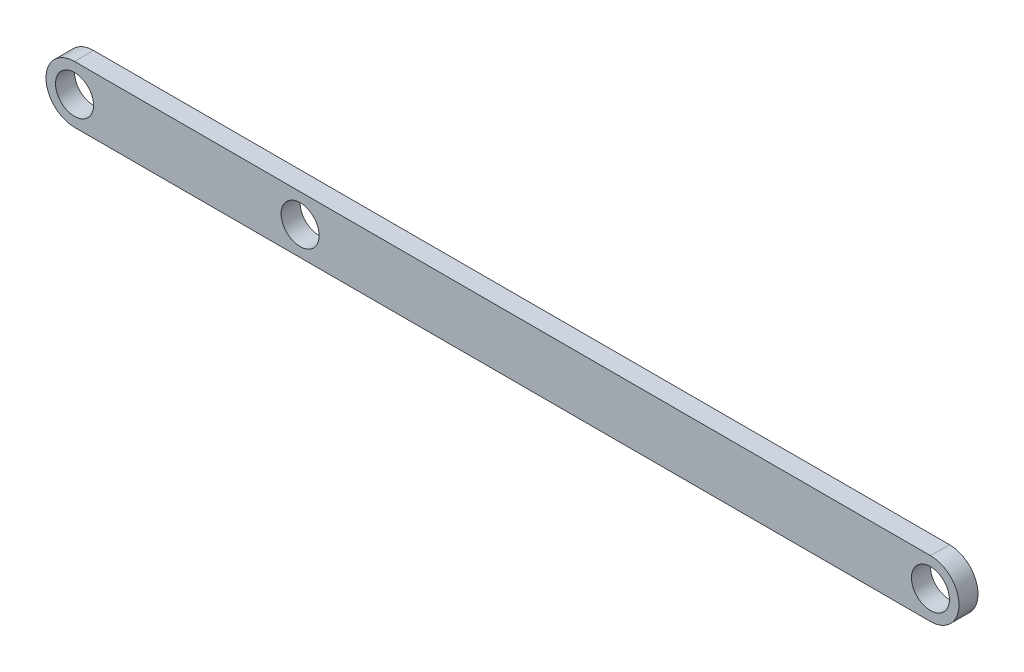
ISO-10303-21;
HEADER;
FILE_DESCRIPTION(('STEP AP214'),'2;1');
FILE_NAME('part.step','',(''),(''),'','','');
FILE_SCHEMA(('AUTOMOTIVE_DESIGN { 1 0 10303 214 1 1 1 1 }'));
ENDSEC;
DATA;
#1=APPLICATION_CONTEXT('core data for automotive mechanical design processes');
#2=APPLICATION_PROTOCOL_DEFINITION('international standard','automotive_design',2000,#1);
#3=PRODUCT_CONTEXT('',#1,'mechanical');
#4=PRODUCT('Part','Part','',(#3));
#5=PRODUCT_RELATED_PRODUCT_CATEGORY('part','',(#4));
#6=PRODUCT_DEFINITION_FORMATION('','',#4);
#7=PRODUCT_DEFINITION_CONTEXT('part definition',#1,'design');
#8=PRODUCT_DEFINITION('design','',#6,#7);
#9=PRODUCT_DEFINITION_SHAPE('','',#8);
#10=(LENGTH_UNIT() NAMED_UNIT(*) SI_UNIT(.MILLI.,.METRE.));
#11=(NAMED_UNIT(*) PLANE_ANGLE_UNIT() SI_UNIT($,.RADIAN.));
#12=(NAMED_UNIT(*) SI_UNIT($,.STERADIAN.) SOLID_ANGLE_UNIT());
#13=UNCERTAINTY_MEASURE_WITH_UNIT(LENGTH_MEASURE(1.E-05),#10,'distance_accuracy_value','');
#14=(GEOMETRIC_REPRESENTATION_CONTEXT(3) GLOBAL_UNCERTAINTY_ASSIGNED_CONTEXT((#13)) GLOBAL_UNIT_ASSIGNED_CONTEXT((#10,
#11,#12)) REPRESENTATION_CONTEXT('',''));
#15=CARTESIAN_POINT('',(0.,0.,0.));
#16=DIRECTION('',(0.,0.,1.));
#17=DIRECTION('',(1.,0.,0.));
#18=AXIS2_PLACEMENT_3D('',#15,#16,#17);
#19=CARTESIAN_POINT('',(0.,30.,10.));
#20=DIRECTION('',(0.,-1.,0.));
#21=DIRECTION('',(1.,0.,0.));
#22=AXIS2_PLACEMENT_3D('',#19,#20,#21);
#23=PLANE('',#22);
#24=DIRECTION('',(-1.,0.,0.));
#25=VECTOR('',#24,1.);
#26=CARTESIAN_POINT('',(0.,30.,0.));
#27=LINE('',#26,#25);
#28=CARTESIAN_POINT('',(0.,30.,0.));
#29=VERTEX_POINT('',#28);
#30=CARTESIAN_POINT('',(-450.,29.9999999999999,0.));
#31=VERTEX_POINT('',#30);
#32=EDGE_CURVE('E106',#29,#31,#27,.T.);
#33=ORIENTED_EDGE('',*,*,#32,.T.);
#34=DIRECTION('',(0.,0.,-1.));
#35=VECTOR('',#34,1.);
#36=CARTESIAN_POINT('',(-450.,29.9999999999999,10.));
#37=LINE('',#36,#35);
#38=CARTESIAN_POINT('',(-450.,29.9999999999999,10.));
#39=VERTEX_POINT('',#38);
#40=EDGE_CURVE('E11',#39,#31,#37,.T.);
#41=ORIENTED_EDGE('',*,*,#40,.F.);
#42=DIRECTION('',(-1.,0.,0.));
#43=VECTOR('',#42,1.);
#44=CARTESIAN_POINT('',(0.,30.,10.));
#45=LINE('',#44,#43);
#46=CARTESIAN_POINT('',(0.,30.,10.));
#47=VERTEX_POINT('',#46);
#48=EDGE_CURVE('E87',#47,#39,#45,.T.);
#49=ORIENTED_EDGE('',*,*,#48,.F.);
#50=DIRECTION('',(0.,0.,-1.));
#51=VECTOR('',#50,1.);
#52=CARTESIAN_POINT('',(0.,30.,10.));
#53=LINE('',#52,#51);
#54=EDGE_CURVE('E102',#47,#29,#53,.T.);
#55=ORIENTED_EDGE('',*,*,#54,.T.);
#56=EDGE_LOOP('',(#33,#41,#49,#55));
#57=FACE_BOUND('',#56,.T.);
#58=ADVANCED_FACE('F39',(#57),#23,.F.);
#59=CARTESIAN_POINT('',(-450.,14.9999999999999,10.));
#60=DIRECTION('',(0.,0.,-1.));
#61=DIRECTION('',(-1.,0.,0.));
#62=AXIS2_PLACEMENT_3D('',#59,#60,#61);
#63=CYLINDRICAL_SURFACE('',#62,15.);
#64=CARTESIAN_POINT('',(-450.,14.9999999999999,0.));
#65=DIRECTION('',(0.,0.,1.));
#66=DIRECTION('',(1.,0.,0.));
#67=AXIS2_PLACEMENT_3D('',#64,#65,#66);
#68=CIRCLE('',#67,15.);
#69=CARTESIAN_POINT('',(-450.,0.,0.));
#70=VERTEX_POINT('',#69);
#71=EDGE_CURVE('E93',#31,#70,#68,.T.);
#72=ORIENTED_EDGE('',*,*,#71,.T.);
#73=DIRECTION('',(0.,0.,-1.));
#74=VECTOR('',#73,1.);
#75=CARTESIAN_POINT('',(-450.,0.,10.));
#76=LINE('',#75,#74);
#77=CARTESIAN_POINT('',(-450.,0.,10.));
#78=VERTEX_POINT('',#77);
#79=EDGE_CURVE('E48',#78,#70,#76,.T.);
#80=ORIENTED_EDGE('',*,*,#79,.F.);
#81=CARTESIAN_POINT('',(-450.,14.9999999999999,10.));
#82=DIRECTION('',(0.,0.,1.));
#83=DIRECTION('',(1.,0.,0.));
#84=AXIS2_PLACEMENT_3D('',#81,#82,#83);
#85=CIRCLE('',#84,15.);
#86=EDGE_CURVE('E82',#39,#78,#85,.T.);
#87=ORIENTED_EDGE('',*,*,#86,.F.);
#88=ORIENTED_EDGE('',*,*,#40,.T.);
#89=EDGE_LOOP('',(#72,#80,#87,#88));
#90=FACE_BOUND('',#89,.T.);
#91=ADVANCED_FACE('F92',(#90),#63,.T.);
#92=CARTESIAN_POINT('',(0.,0.,10.));
#93=DIRECTION('',(0.,-1.,0.));
#94=DIRECTION('',(1.,0.,0.));
#95=AXIS2_PLACEMENT_3D('',#92,#93,#94);
#96=PLANE('',#95);
#97=DIRECTION('',(-1.,0.,0.));
#98=VECTOR('',#97,1.);
#99=CARTESIAN_POINT('',(0.,0.,0.));
#100=LINE('',#99,#98);
#101=CARTESIAN_POINT('',(0.,0.,0.));
#102=VERTEX_POINT('',#101);
#103=EDGE_CURVE('E113',#102,#70,#100,.T.);
#104=ORIENTED_EDGE('',*,*,#103,.F.);
#105=DIRECTION('',(0.,0.,-1.));
#106=VECTOR('',#105,1.);
#107=CARTESIAN_POINT('',(0.,0.,10.));
#108=LINE('',#107,#106);
#109=CARTESIAN_POINT('',(0.,0.,10.));
#110=VERTEX_POINT('',#109);
#111=EDGE_CURVE('E72',#110,#102,#108,.T.);
#112=ORIENTED_EDGE('',*,*,#111,.F.);
#113=DIRECTION('',(-1.,0.,0.));
#114=VECTOR('',#113,1.);
#115=CARTESIAN_POINT('',(0.,0.,10.));
#116=LINE('',#115,#114);
#117=EDGE_CURVE('E85',#110,#78,#116,.T.);
#118=ORIENTED_EDGE('',*,*,#117,.T.);
#119=ORIENTED_EDGE('',*,*,#79,.T.);
#120=EDGE_LOOP('',(#104,#112,#118,#119));
#121=FACE_BOUND('',#120,.T.);
#122=ADVANCED_FACE('F98',(#121),#96,.T.);
#123=CARTESIAN_POINT('',(0.,15.,10.));
#124=DIRECTION('',(0.,0.,-1.));
#125=DIRECTION('',(-1.,0.,0.));
#126=AXIS2_PLACEMENT_3D('',#123,#124,#125);
#127=CYLINDRICAL_SURFACE('',#126,15.);
#128=CARTESIAN_POINT('',(0.,15.,0.));
#129=DIRECTION('',(0.,0.,1.));
#130=DIRECTION('',(1.,0.,0.));
#131=AXIS2_PLACEMENT_3D('',#128,#129,#130);
#132=CIRCLE('',#131,15.);
#133=EDGE_CURVE('E75',#102,#29,#132,.T.);
#134=ORIENTED_EDGE('',*,*,#133,.T.);
#135=ORIENTED_EDGE('',*,*,#54,.F.);
#136=CARTESIAN_POINT('',(0.,15.,10.));
#137=DIRECTION('',(0.,0.,1.));
#138=DIRECTION('',(1.,0.,0.));
#139=AXIS2_PLACEMENT_3D('',#136,#137,#138);
#140=CIRCLE('',#139,15.);
#141=EDGE_CURVE('E56',#110,#47,#140,.T.);
#142=ORIENTED_EDGE('',*,*,#141,.F.);
#143=ORIENTED_EDGE('',*,*,#111,.T.);
#144=EDGE_LOOP('',(#134,#135,#142,#143));
#145=FACE_BOUND('',#144,.T.);
#146=ADVANCED_FACE('F136',(#145),#127,.T.);
#147=CARTESIAN_POINT('',(-450.,14.9999999999999,10.));
#148=DIRECTION('',(0.,0.,1.));
#149=DIRECTION('',(1.,0.,0.));
#150=AXIS2_PLACEMENT_3D('',#147,#148,#149);
#151=PLANE('',#150);
#152=CARTESIAN_POINT('',(-331.40838443026,14.9999999999999,10.));
#153=DIRECTION('',(0.,0.,1.));
#154=DIRECTION('',(1.,0.,0.));
#155=AXIS2_PLACEMENT_3D('',#152,#153,#154);
#156=CIRCLE('',#155,9.99999999999998);
#157=CARTESIAN_POINT('',(-321.40838443026,14.9999999999999,10.));
#158=VERTEX_POINT('',#157);
#159=EDGE_CURVE('E216',#158,#158,#156,.T.);
#160=ORIENTED_EDGE('',*,*,#159,.F.);
#161=EDGE_LOOP('',(#160));
#162=FACE_BOUND('',#161,.T.);
#163=CARTESIAN_POINT('',(0.,15.,10.));
#164=DIRECTION('',(0.,0.,-1.));
#165=DIRECTION('',(-1.,0.,0.));
#166=AXIS2_PLACEMENT_3D('',#163,#164,#165);
#167=CIRCLE('',#166,10.);
#168=CARTESIAN_POINT('',(-10.,15.,10.));
#169=VERTEX_POINT('',#168);
#170=EDGE_CURVE('E110',#169,#169,#167,.T.);
#171=ORIENTED_EDGE('',*,*,#170,.T.);
#172=EDGE_LOOP('',(#171));
#173=FACE_BOUND('',#172,.T.);
#174=CARTESIAN_POINT('',(-450.,14.9999999999999,10.));
#175=DIRECTION('',(0.,0.,-1.));
#176=DIRECTION('',(-1.,0.,0.));
#177=AXIS2_PLACEMENT_3D('',#174,#175,#176);
#178=CIRCLE('',#177,9.99999999999998);
#179=CARTESIAN_POINT('',(-460.,14.9999999999999,10.));
#180=VERTEX_POINT('',#179);
#181=EDGE_CURVE('E199',#180,#180,#178,.T.);
#182=ORIENTED_EDGE('',*,*,#181,.T.);
#183=EDGE_LOOP('',(#182));
#184=FACE_BOUND('',#183,.T.);
#185=ORIENTED_EDGE('',*,*,#48,.T.);
#186=ORIENTED_EDGE('',*,*,#86,.T.);
#187=ORIENTED_EDGE('',*,*,#117,.F.);
#188=ORIENTED_EDGE('',*,*,#141,.T.);
#189=EDGE_LOOP('',(#185,#186,#187,#188));
#190=FACE_BOUND('',#189,.T.);
#191=ADVANCED_FACE('F83',(#162,#173,#184,#190),#151,.T.);
#192=CARTESIAN_POINT('',(-450.,14.9999999999999,0.));
#193=DIRECTION('',(0.,0.,1.));
#194=DIRECTION('',(1.,0.,0.));
#195=AXIS2_PLACEMENT_3D('',#192,#193,#194);
#196=PLANE('',#195);
#197=CARTESIAN_POINT('',(-331.40838443026,14.9999999999999,0.));
#198=DIRECTION('',(0.,0.,1.));
#199=DIRECTION('',(1.,0.,0.));
#200=AXIS2_PLACEMENT_3D('',#197,#198,#199);
#201=CIRCLE('',#200,9.99999999999998);
#202=CARTESIAN_POINT('',(-321.40838443026,14.9999999999999,0.));
#203=VERTEX_POINT('',#202);
#204=EDGE_CURVE('E211',#203,#203,#201,.T.);
#205=ORIENTED_EDGE('',*,*,#204,.T.);
#206=EDGE_LOOP('',(#205));
#207=FACE_BOUND('',#206,.T.);
#208=CARTESIAN_POINT('',(0.,15.,0.));
#209=DIRECTION('',(0.,0.,-1.));
#210=DIRECTION('',(-1.,0.,0.));
#211=AXIS2_PLACEMENT_3D('',#208,#209,#210);
#212=CIRCLE('',#211,10.);
#213=CARTESIAN_POINT('',(-10.,15.,0.));
#214=VERTEX_POINT('',#213);
#215=EDGE_CURVE('E197',#214,#214,#212,.T.);
#216=ORIENTED_EDGE('',*,*,#215,.F.);
#217=EDGE_LOOP('',(#216));
#218=FACE_BOUND('',#217,.T.);
#219=CARTESIAN_POINT('',(-450.,14.9999999999999,0.));
#220=DIRECTION('',(0.,0.,-1.));
#221=DIRECTION('',(-1.,0.,0.));
#222=AXIS2_PLACEMENT_3D('',#219,#220,#221);
#223=CIRCLE('',#222,9.99999999999998);
#224=CARTESIAN_POINT('',(-460.,14.9999999999999,0.));
#225=VERTEX_POINT('',#224);
#226=EDGE_CURVE('E205',#225,#225,#223,.T.);
#227=ORIENTED_EDGE('',*,*,#226,.F.);
#228=EDGE_LOOP('',(#227));
#229=FACE_BOUND('',#228,.T.);
#230=ORIENTED_EDGE('',*,*,#32,.F.);
#231=ORIENTED_EDGE('',*,*,#133,.F.);
#232=ORIENTED_EDGE('',*,*,#103,.T.);
#233=ORIENTED_EDGE('',*,*,#71,.F.);
#234=EDGE_LOOP('',(#230,#231,#232,#233));
#235=FACE_BOUND('',#234,.T.);
#236=ADVANCED_FACE('F124',(#207,#218,#229,#235),#196,.F.);
#237=CARTESIAN_POINT('',(-450.,14.9999999999999,10.));
#238=DIRECTION('',(0.,0.,-1.));
#239=DIRECTION('',(-1.,0.,0.));
#240=AXIS2_PLACEMENT_3D('',#237,#238,#239);
#241=CYLINDRICAL_SURFACE('',#240,9.99999999999998);
#242=ORIENTED_EDGE('',*,*,#181,.F.);
#243=EDGE_LOOP('',(#242));
#244=FACE_BOUND('',#243,.T.);
#245=ORIENTED_EDGE('',*,*,#226,.T.);
#246=EDGE_LOOP('',(#245));
#247=FACE_BOUND('',#246,.T.);
#248=ADVANCED_FACE('F126',(#244,#247),#241,.F.);
#249=CARTESIAN_POINT('',(0.,15.,10.));
#250=DIRECTION('',(0.,0.,-1.));
#251=DIRECTION('',(-1.,0.,0.));
#252=AXIS2_PLACEMENT_3D('',#249,#250,#251);
#253=CYLINDRICAL_SURFACE('',#252,10.);
#254=ORIENTED_EDGE('',*,*,#170,.F.);
#255=EDGE_LOOP('',(#254));
#256=FACE_BOUND('',#255,.T.);
#257=ORIENTED_EDGE('',*,*,#215,.T.);
#258=EDGE_LOOP('',(#257));
#259=FACE_BOUND('',#258,.T.);
#260=ADVANCED_FACE('F133',(#256,#259),#253,.F.);
#261=CARTESIAN_POINT('',(-331.40838443026,14.9999999999999,0.));
#262=DIRECTION('',(0.,0.,1.));
#263=DIRECTION('',(1.,0.,0.));
#264=AXIS2_PLACEMENT_3D('',#261,#262,#263);
#265=CYLINDRICAL_SURFACE('',#264,9.99999999999998);
#266=ORIENTED_EDGE('',*,*,#204,.F.);
#267=EDGE_LOOP('',(#266));
#268=FACE_BOUND('',#267,.T.);
#269=ORIENTED_EDGE('',*,*,#159,.T.);
#270=EDGE_LOOP('',(#269));
#271=FACE_BOUND('',#270,.T.);
#272=ADVANCED_FACE('F174',(#268,#271),#265,.F.);
#273=CLOSED_SHELL('',(#58,#91,#122,#146,#191,#236,#248,#260,#272));
#274=MANIFOLD_SOLID_BREP('B2',#273);
#275=ADVANCED_BREP_SHAPE_REPRESENTATION('',(#18,#274),#14);
#276=SHAPE_DEFINITION_REPRESENTATION(#9,#275);
ENDSEC;
END-ISO-10303-21;
